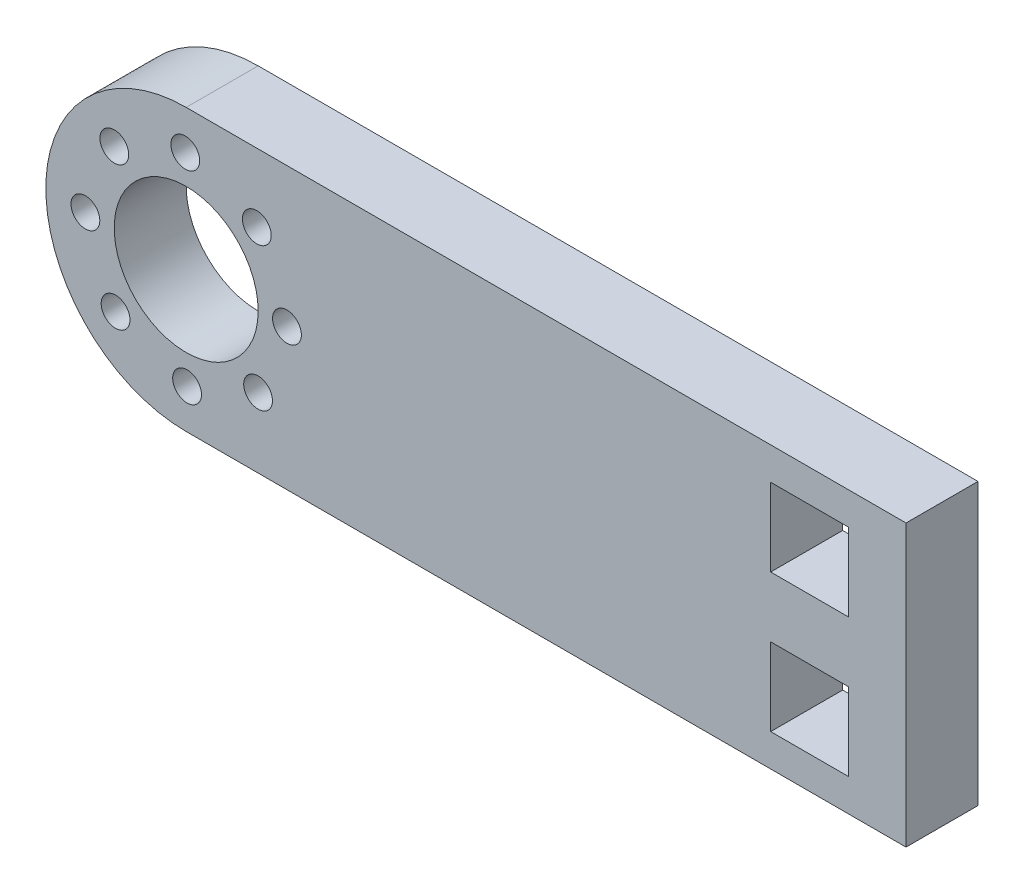
ISO-10303-21;
HEADER;
FILE_DESCRIPTION(('STEP AP214'),'2;1');
FILE_NAME('part.step','',(''),(''),'','','');
FILE_SCHEMA(('AUTOMOTIVE_DESIGN { 1 0 10303 214 1 1 1 1 }'));
ENDSEC;
DATA;
#1=APPLICATION_CONTEXT('core data for automotive mechanical design processes');
#2=APPLICATION_PROTOCOL_DEFINITION('international standard','automotive_design',2000,#1);
#3=PRODUCT_CONTEXT('',#1,'mechanical');
#4=PRODUCT('Part','Part','',(#3));
#5=PRODUCT_RELATED_PRODUCT_CATEGORY('part','',(#4));
#6=PRODUCT_DEFINITION_FORMATION('','',#4);
#7=PRODUCT_DEFINITION_CONTEXT('part definition',#1,'design');
#8=PRODUCT_DEFINITION('design','',#6,#7);
#9=PRODUCT_DEFINITION_SHAPE('','',#8);
#10=(LENGTH_UNIT() NAMED_UNIT(*) SI_UNIT(.MILLI.,.METRE.));
#11=(NAMED_UNIT(*) PLANE_ANGLE_UNIT() SI_UNIT($,.RADIAN.));
#12=(NAMED_UNIT(*) SI_UNIT($,.STERADIAN.) SOLID_ANGLE_UNIT());
#13=UNCERTAINTY_MEASURE_WITH_UNIT(LENGTH_MEASURE(1.E-05),#10,'distance_accuracy_value','');
#14=(GEOMETRIC_REPRESENTATION_CONTEXT(3) GLOBAL_UNCERTAINTY_ASSIGNED_CONTEXT((#13)) GLOBAL_UNIT_ASSIGNED_CONTEXT((#10,
#11,#12)) REPRESENTATION_CONTEXT('',''));
#15=CARTESIAN_POINT('',(0.,0.,0.));
#16=DIRECTION('',(0.,0.,1.));
#17=DIRECTION('',(1.,0.,0.));
#18=AXIS2_PLACEMENT_3D('',#15,#16,#17);
#19=CARTESIAN_POINT('',(-5.74908406047262,2.29229165398919,5.));
#20=DIRECTION('',(0.,0.,1.));
#21=DIRECTION('',(1.,0.,0.));
#22=AXIS2_PLACEMENT_3D('',#19,#20,#21);
#23=PLANE('',#22);
#24=CARTESIAN_POINT('',(-10.6544742356254,-2.7014191135177,5.));
#25=DIRECTION('',(0.,0.,1.));
#26=DIRECTION('',(1.,0.,0.));
#27=AXIS2_PLACEMENT_3D('',#24,#25,#26);
#28=CIRCLE('',#27,0.999999999999998);
#29=CARTESIAN_POINT('',(-9.65447423562543,-2.7014191135177,5.));
#30=VERTEX_POINT('',#29);
#31=EDGE_CURVE('E197',#30,#30,#28,.T.);
#32=ORIENTED_EDGE('',*,*,#31,.F.);
#33=EDGE_LOOP('',(#32));
#34=FACE_BOUND('',#33,.T.);
#35=CARTESIAN_POINT('',(-0.755373292965727,-2.61309852116362,5.));
#36=DIRECTION('',(0.,0.,1.));
#37=DIRECTION('',(1.,0.,0.));
#38=AXIS2_PLACEMENT_3D('',#35,#36,#37);
#39=CIRCLE('',#38,1.);
#40=CARTESIAN_POINT('',(0.244626707034274,-2.61309852116362,5.));
#41=VERTEX_POINT('',#40);
#42=EDGE_CURVE('E209',#41,#41,#39,.T.);
#43=ORIENTED_EDGE('',*,*,#42,.F.);
#44=EDGE_LOOP('',(#43));
#45=FACE_BOUND('',#44,.T.);
#46=CARTESIAN_POINT('',(-0.843693885319811,7.28600242149609,5.));
#47=DIRECTION('',(0.,0.,1.));
#48=DIRECTION('',(1.,0.,0.));
#49=AXIS2_PLACEMENT_3D('',#46,#47,#48);
#50=CIRCLE('',#49,1.);
#51=CARTESIAN_POINT('',(0.156306114680189,7.28600242149609,5.));
#52=VERTEX_POINT('',#51);
#53=EDGE_CURVE('E221',#52,#52,#50,.T.);
#54=ORIENTED_EDGE('',*,*,#53,.F.);
#55=EDGE_LOOP('',(#54));
#56=FACE_BOUND('',#55,.T.);
#57=CARTESIAN_POINT('',(-10.7427948279795,7.197681829142,5.));
#58=DIRECTION('',(0.,0.,1.));
#59=DIRECTION('',(1.,0.,0.));
#60=AXIS2_PLACEMENT_3D('',#57,#58,#59);
#61=CIRCLE('',#60,1.);
#62=CARTESIAN_POINT('',(-9.74279482797952,7.197681829142,5.));
#63=VERTEX_POINT('',#62);
#64=EDGE_CURVE('E233',#63,#63,#61,.T.);
#65=ORIENTED_EDGE('',*,*,#64,.F.);
#66=EDGE_LOOP('',(#65));
#67=FACE_BOUND('',#66,.T.);
#68=CARTESIAN_POINT('',(-5.74908406047262,2.29229165398919,5.));
#69=DIRECTION('',(0.,0.,1.));
#70=DIRECTION('',(1.,0.,0.));
#71=AXIS2_PLACEMENT_3D('',#68,#69,#70);
#72=CIRCLE('',#71,9.75);
#73=CARTESIAN_POINT('',(-5.74908406047262,12.0422916539892,5.));
#74=VERTEX_POINT('',#73);
#75=CARTESIAN_POINT('',(-5.74908406047262,-7.45770834601081,5.));
#76=VERTEX_POINT('',#75);
#77=EDGE_CURVE('E245',#74,#76,#72,.T.);
#78=ORIENTED_EDGE('',*,*,#77,.T.);
#79=DIRECTION('',(1.,0.,0.));
#80=VECTOR('',#79,1.);
#81=CARTESIAN_POINT('',(44.2509159395274,-7.4577083460108,5.));
#82=LINE('',#81,#80);
#83=CARTESIAN_POINT('',(44.2509159395274,-7.4577083460108,5.));
#84=VERTEX_POINT('',#83);
#85=EDGE_CURVE('E248',#76,#84,#82,.T.);
#86=ORIENTED_EDGE('',*,*,#85,.T.);
#87=DIRECTION('',(0.,1.,0.));
#88=VECTOR('',#87,1.);
#89=CARTESIAN_POINT('',(44.2509159395274,12.0422916539892,5.));
#90=LINE('',#89,#88);
#91=CARTESIAN_POINT('',(44.2509159395274,12.0422916539892,5.));
#92=VERTEX_POINT('',#91);
#93=EDGE_CURVE('E251',#84,#92,#90,.T.);
#94=ORIENTED_EDGE('',*,*,#93,.T.);
#95=DIRECTION('',(-1.,0.,0.));
#96=VECTOR('',#95,1.);
#97=CARTESIAN_POINT('',(-5.74908406047262,12.0422916539892,5.));
#98=LINE('',#97,#96);
#99=EDGE_CURVE('E253',#92,#74,#98,.T.);
#100=ORIENTED_EDGE('',*,*,#99,.T.);
#101=EDGE_LOOP('',(#78,#86,#94,#100));
#102=FACE_BOUND('',#101,.T.);
#103=CARTESIAN_POINT('',(-5.8115386358992,9.29229165398919,5.));
#104=DIRECTION('',(0.,0.,1.));
#105=DIRECTION('',(1.,0.,0.));
#106=AXIS2_PLACEMENT_3D('',#103,#104,#105);
#107=CIRCLE('',#106,0.999999999999999);
#108=CARTESIAN_POINT('',(-4.81153863589921,9.29229165398919,5.));
#109=VERTEX_POINT('',#108);
#110=EDGE_CURVE('E239',#109,#109,#107,.T.);
#111=ORIENTED_EDGE('',*,*,#110,.F.);
#112=EDGE_LOOP('',(#111));
#113=FACE_BOUND('',#112,.T.);
#114=CARTESIAN_POINT('',(-12.7490840604726,2.22983707856261,5.));
#115=DIRECTION('',(0.,0.,1.));
#116=DIRECTION('',(1.,0.,0.));
#117=AXIS2_PLACEMENT_3D('',#114,#115,#116);
#118=CIRCLE('',#117,0.999999999999998);
#119=CARTESIAN_POINT('',(-11.7490840604726,2.22983707856261,5.));
#120=VERTEX_POINT('',#119);
#121=EDGE_CURVE('E227',#120,#120,#118,.T.);
#122=ORIENTED_EDGE('',*,*,#121,.F.);
#123=EDGE_LOOP('',(#122));
#124=FACE_BOUND('',#123,.T.);
#125=CARTESIAN_POINT('',(1.25091593952738,2.35474622941577,5.));
#126=DIRECTION('',(0.,0.,1.));
#127=DIRECTION('',(1.,0.,0.));
#128=AXIS2_PLACEMENT_3D('',#125,#126,#127);
#129=CIRCLE('',#128,1.);
#130=CARTESIAN_POINT('',(2.25091593952738,2.35474622941577,5.));
#131=VERTEX_POINT('',#130);
#132=EDGE_CURVE('E215',#131,#131,#129,.T.);
#133=ORIENTED_EDGE('',*,*,#132,.F.);
#134=EDGE_LOOP('',(#133));
#135=FACE_BOUND('',#134,.T.);
#136=CARTESIAN_POINT('',(-5.68662948504604,-4.70770834601081,5.));
#137=DIRECTION('',(0.,0.,1.));
#138=DIRECTION('',(1.,0.,0.));
#139=AXIS2_PLACEMENT_3D('',#136,#137,#138);
#140=CIRCLE('',#139,1.);
#141=CARTESIAN_POINT('',(-4.68662948504604,-4.70770834601081,5.));
#142=VERTEX_POINT('',#141);
#143=EDGE_CURVE('E203',#142,#142,#140,.T.);
#144=ORIENTED_EDGE('',*,*,#143,.F.);
#145=EDGE_LOOP('',(#144));
#146=FACE_BOUND('',#145,.T.);
#147=CARTESIAN_POINT('',(-5.74908406047262,2.29229165398919,5.));
#148=DIRECTION('',(0.,0.,1.));
#149=DIRECTION('',(1.,0.,0.));
#150=AXIS2_PLACEMENT_3D('',#147,#148,#149);
#151=CIRCLE('',#150,5.);
#152=CARTESIAN_POINT('',(-0.749084060472621,2.29229165398919,5.));
#153=VERTEX_POINT('',#152);
#154=EDGE_CURVE('E191',#153,#153,#151,.T.);
#155=ORIENTED_EDGE('',*,*,#154,.F.);
#156=EDGE_LOOP('',(#155));
#157=FACE_BOUND('',#156,.T.);
#158=DIRECTION('',(1.,0.,0.));
#159=VECTOR('',#158,1.);
#160=CARTESIAN_POINT('',(34.8509159395274,4.39229165398919,5.));
#161=LINE('',#160,#159);
#162=CARTESIAN_POINT('',(34.8509159395274,4.39229165398919,5.));
#163=VERTEX_POINT('',#162);
#164=CARTESIAN_POINT('',(40.2509159395274,4.39229165398919,5.));
#165=VERTEX_POINT('',#164);
#166=EDGE_CURVE('E162',#163,#165,#161,.T.);
#167=ORIENTED_EDGE('',*,*,#166,.F.);
#168=DIRECTION('',(0.,-1.,0.));
#169=VECTOR('',#168,1.);
#170=CARTESIAN_POINT('',(34.8509159395274,9.79229165398919,5.));
#171=LINE('',#170,#169);
#172=CARTESIAN_POINT('',(34.8509159395274,9.79229165398919,5.));
#173=VERTEX_POINT('',#172);
#174=EDGE_CURVE('E160',#173,#163,#171,.T.);
#175=ORIENTED_EDGE('',*,*,#174,.F.);
#176=DIRECTION('',(-1.,0.,0.));
#177=VECTOR('',#176,1.);
#178=CARTESIAN_POINT('',(34.8509159395274,9.79229165398919,5.));
#179=LINE('',#178,#177);
#180=CARTESIAN_POINT('',(40.2509159395274,9.79229165398919,5.));
#181=VERTEX_POINT('',#180);
#182=EDGE_CURVE('E168',#181,#173,#179,.T.);
#183=ORIENTED_EDGE('',*,*,#182,.F.);
#184=DIRECTION('',(0.,1.,0.));
#185=VECTOR('',#184,1.);
#186=CARTESIAN_POINT('',(40.2509159395274,9.79229165398919,5.));
#187=LINE('',#186,#185);
#188=EDGE_CURVE('E165',#165,#181,#187,.T.);
#189=ORIENTED_EDGE('',*,*,#188,.F.);
#190=EDGE_LOOP('',(#167,#175,#183,#189));
#191=FACE_BOUND('',#190,.T.);
#192=DIRECTION('',(1.,0.,0.));
#193=VECTOR('',#192,1.);
#194=CARTESIAN_POINT('',(34.8509159395274,-5.20770834601081,5.));
#195=LINE('',#194,#193);
#196=CARTESIAN_POINT('',(34.8509159395274,-5.20770834601081,5.));
#197=VERTEX_POINT('',#196);
#198=CARTESIAN_POINT('',(40.2509159395274,-5.20770834601081,5.));
#199=VERTEX_POINT('',#198);
#200=EDGE_CURVE('E132',#197,#199,#195,.T.);
#201=ORIENTED_EDGE('',*,*,#200,.F.);
#202=DIRECTION('',(0.,-1.,0.));
#203=VECTOR('',#202,1.);
#204=CARTESIAN_POINT('',(34.8509159395274,0.192291653989192,5.));
#205=LINE('',#204,#203);
#206=CARTESIAN_POINT('',(34.8509159395274,0.192291653989192,5.));
#207=VERTEX_POINT('',#206);
#208=EDGE_CURVE('E124',#207,#197,#205,.T.);
#209=ORIENTED_EDGE('',*,*,#208,.F.);
#210=DIRECTION('',(-1.,0.,0.));
#211=VECTOR('',#210,1.);
#212=CARTESIAN_POINT('',(34.8509159395274,0.192291653989192,5.));
#213=LINE('',#212,#211);
#214=CARTESIAN_POINT('',(40.2509159395274,0.192291653989191,5.));
#215=VERTEX_POINT('',#214);
#216=EDGE_CURVE('E146',#215,#207,#213,.T.);
#217=ORIENTED_EDGE('',*,*,#216,.F.);
#218=DIRECTION('',(0.,1.,0.));
#219=VECTOR('',#218,1.);
#220=CARTESIAN_POINT('',(40.2509159395274,0.192291653989192,5.));
#221=LINE('',#220,#219);
#222=EDGE_CURVE('E144',#199,#215,#221,.T.);
#223=ORIENTED_EDGE('',*,*,#222,.F.);
#224=EDGE_LOOP('',(#201,#209,#217,#223));
#225=FACE_BOUND('',#224,.T.);
#226=ADVANCED_FACE('F35',(#34,#45,#56,#67,#102,#113,#124,#135,#146,#157,#191,#225),#23,.T.);
#227=CARTESIAN_POINT('',(-5.74908406047262,2.29229165398919,0.));
#228=DIRECTION('',(0.,0.,1.));
#229=DIRECTION('',(1.,0.,0.));
#230=AXIS2_PLACEMENT_3D('',#227,#228,#229);
#231=PLANE('',#230);
#232=DIRECTION('',(0.,-1.,0.));
#233=VECTOR('',#232,1.);
#234=CARTESIAN_POINT('',(34.8509159395274,9.79229165398919,0.));
#235=LINE('',#234,#233);
#236=CARTESIAN_POINT('',(34.8509159395274,9.79229165398919,0.));
#237=VERTEX_POINT('',#236);
#238=CARTESIAN_POINT('',(34.8509159395274,4.39229165398919,0.));
#239=VERTEX_POINT('',#238);
#240=EDGE_CURVE('E140',#237,#239,#235,.T.);
#241=ORIENTED_EDGE('',*,*,#240,.T.);
#242=DIRECTION('',(1.,0.,0.));
#243=VECTOR('',#242,1.);
#244=CARTESIAN_POINT('',(34.8509159395274,4.39229165398919,0.));
#245=LINE('',#244,#243);
#246=CARTESIAN_POINT('',(40.2509159395274,4.39229165398919,0.));
#247=VERTEX_POINT('',#246);
#248=EDGE_CURVE('E173',#239,#247,#245,.T.);
#249=ORIENTED_EDGE('',*,*,#248,.T.);
#250=DIRECTION('',(0.,1.,0.));
#251=VECTOR('',#250,1.);
#252=CARTESIAN_POINT('',(40.2509159395274,9.79229165398919,0.));
#253=LINE('',#252,#251);
#254=CARTESIAN_POINT('',(40.2509159395274,9.79229165398919,0.));
#255=VERTEX_POINT('',#254);
#256=EDGE_CURVE('E176',#247,#255,#253,.T.);
#257=ORIENTED_EDGE('',*,*,#256,.T.);
#258=DIRECTION('',(-1.,0.,0.));
#259=VECTOR('',#258,1.);
#260=CARTESIAN_POINT('',(34.8509159395274,9.79229165398919,0.));
#261=LINE('',#260,#259);
#262=EDGE_CURVE('E163',#255,#237,#261,.T.);
#263=ORIENTED_EDGE('',*,*,#262,.T.);
#264=EDGE_LOOP('',(#241,#249,#257,#263));
#265=FACE_BOUND('',#264,.T.);
#266=CARTESIAN_POINT('',(-5.74908406047262,2.29229165398919,0.));
#267=DIRECTION('',(0.,0.,1.));
#268=DIRECTION('',(1.,0.,0.));
#269=AXIS2_PLACEMENT_3D('',#266,#267,#268);
#270=CIRCLE('',#269,9.75);
#271=CARTESIAN_POINT('',(-5.74908406047262,12.0422916539892,0.));
#272=VERTEX_POINT('',#271);
#273=CARTESIAN_POINT('',(-5.74908406047262,-7.45770834601081,0.));
#274=VERTEX_POINT('',#273);
#275=EDGE_CURVE('E242',#272,#274,#270,.T.);
#276=ORIENTED_EDGE('',*,*,#275,.F.);
#277=DIRECTION('',(-1.,0.,0.));
#278=VECTOR('',#277,1.);
#279=CARTESIAN_POINT('',(-5.74908406047262,12.0422916539892,0.));
#280=LINE('',#279,#278);
#281=CARTESIAN_POINT('',(44.2509159395274,12.0422916539892,0.));
#282=VERTEX_POINT('',#281);
#283=EDGE_CURVE('E249',#282,#272,#280,.T.);
#284=ORIENTED_EDGE('',*,*,#283,.F.);
#285=DIRECTION('',(0.,1.,0.));
#286=VECTOR('',#285,1.);
#287=CARTESIAN_POINT('',(44.2509159395274,12.0422916539892,0.));
#288=LINE('',#287,#286);
#289=CARTESIAN_POINT('',(44.2509159395274,-7.4577083460108,0.));
#290=VERTEX_POINT('',#289);
#291=EDGE_CURVE('E260',#290,#282,#288,.T.);
#292=ORIENTED_EDGE('',*,*,#291,.F.);
#293=DIRECTION('',(1.,0.,0.));
#294=VECTOR('',#293,1.);
#295=CARTESIAN_POINT('',(44.2509159395274,-7.4577083460108,0.));
#296=LINE('',#295,#294);
#297=EDGE_CURVE('E258',#274,#290,#296,.T.);
#298=ORIENTED_EDGE('',*,*,#297,.F.);
#299=EDGE_LOOP('',(#276,#284,#292,#298));
#300=FACE_BOUND('',#299,.T.);
#301=CARTESIAN_POINT('',(-5.8115386358992,9.29229165398919,0.));
#302=DIRECTION('',(0.,0.,1.));
#303=DIRECTION('',(1.,0.,0.));
#304=AXIS2_PLACEMENT_3D('',#301,#302,#303);
#305=CIRCLE('',#304,0.999999999999999);
#306=CARTESIAN_POINT('',(-4.81153863589921,9.29229165398919,0.));
#307=VERTEX_POINT('',#306);
#308=EDGE_CURVE('E236',#307,#307,#305,.T.);
#309=ORIENTED_EDGE('',*,*,#308,.T.);
#310=EDGE_LOOP('',(#309));
#311=FACE_BOUND('',#310,.T.);
#312=CARTESIAN_POINT('',(-10.7427948279795,7.197681829142,0.));
#313=DIRECTION('',(0.,0.,1.));
#314=DIRECTION('',(1.,0.,0.));
#315=AXIS2_PLACEMENT_3D('',#312,#313,#314);
#316=CIRCLE('',#315,1.);
#317=CARTESIAN_POINT('',(-9.74279482797952,7.197681829142,0.));
#318=VERTEX_POINT('',#317);
#319=EDGE_CURVE('E230',#318,#318,#316,.T.);
#320=ORIENTED_EDGE('',*,*,#319,.T.);
#321=EDGE_LOOP('',(#320));
#322=FACE_BOUND('',#321,.T.);
#323=CARTESIAN_POINT('',(-12.7490840604726,2.22983707856261,0.));
#324=DIRECTION('',(0.,0.,1.));
#325=DIRECTION('',(1.,0.,0.));
#326=AXIS2_PLACEMENT_3D('',#323,#324,#325);
#327=CIRCLE('',#326,0.999999999999998);
#328=CARTESIAN_POINT('',(-11.7490840604726,2.22983707856261,0.));
#329=VERTEX_POINT('',#328);
#330=EDGE_CURVE('E224',#329,#329,#327,.T.);
#331=ORIENTED_EDGE('',*,*,#330,.T.);
#332=EDGE_LOOP('',(#331));
#333=FACE_BOUND('',#332,.T.);
#334=CARTESIAN_POINT('',(-0.843693885319811,7.28600242149609,0.));
#335=DIRECTION('',(0.,0.,1.));
#336=DIRECTION('',(1.,0.,0.));
#337=AXIS2_PLACEMENT_3D('',#334,#335,#336);
#338=CIRCLE('',#337,1.);
#339=CARTESIAN_POINT('',(0.156306114680189,7.28600242149609,0.));
#340=VERTEX_POINT('',#339);
#341=EDGE_CURVE('E218',#340,#340,#338,.T.);
#342=ORIENTED_EDGE('',*,*,#341,.T.);
#343=EDGE_LOOP('',(#342));
#344=FACE_BOUND('',#343,.T.);
#345=CARTESIAN_POINT('',(1.25091593952738,2.35474622941577,0.));
#346=DIRECTION('',(0.,0.,1.));
#347=DIRECTION('',(1.,0.,0.));
#348=AXIS2_PLACEMENT_3D('',#345,#346,#347);
#349=CIRCLE('',#348,1.);
#350=CARTESIAN_POINT('',(2.25091593952738,2.35474622941577,0.));
#351=VERTEX_POINT('',#350);
#352=EDGE_CURVE('E212',#351,#351,#349,.T.);
#353=ORIENTED_EDGE('',*,*,#352,.T.);
#354=EDGE_LOOP('',(#353));
#355=FACE_BOUND('',#354,.T.);
#356=CARTESIAN_POINT('',(-0.755373292965727,-2.61309852116362,0.));
#357=DIRECTION('',(0.,0.,1.));
#358=DIRECTION('',(1.,0.,0.));
#359=AXIS2_PLACEMENT_3D('',#356,#357,#358);
#360=CIRCLE('',#359,1.);
#361=CARTESIAN_POINT('',(0.244626707034274,-2.61309852116362,0.));
#362=VERTEX_POINT('',#361);
#363=EDGE_CURVE('E206',#362,#362,#360,.T.);
#364=ORIENTED_EDGE('',*,*,#363,.T.);
#365=EDGE_LOOP('',(#364));
#366=FACE_BOUND('',#365,.T.);
#367=CARTESIAN_POINT('',(-5.68662948504604,-4.70770834601081,0.));
#368=DIRECTION('',(0.,0.,1.));
#369=DIRECTION('',(1.,0.,0.));
#370=AXIS2_PLACEMENT_3D('',#367,#368,#369);
#371=CIRCLE('',#370,1.);
#372=CARTESIAN_POINT('',(-4.68662948504604,-4.70770834601081,0.));
#373=VERTEX_POINT('',#372);
#374=EDGE_CURVE('E200',#373,#373,#371,.T.);
#375=ORIENTED_EDGE('',*,*,#374,.T.);
#376=EDGE_LOOP('',(#375));
#377=FACE_BOUND('',#376,.T.);
#378=CARTESIAN_POINT('',(-10.6544742356254,-2.7014191135177,0.));
#379=DIRECTION('',(0.,0.,1.));
#380=DIRECTION('',(1.,0.,0.));
#381=AXIS2_PLACEMENT_3D('',#378,#379,#380);
#382=CIRCLE('',#381,0.999999999999998);
#383=CARTESIAN_POINT('',(-9.65447423562543,-2.7014191135177,0.));
#384=VERTEX_POINT('',#383);
#385=EDGE_CURVE('E194',#384,#384,#382,.T.);
#386=ORIENTED_EDGE('',*,*,#385,.T.);
#387=EDGE_LOOP('',(#386));
#388=FACE_BOUND('',#387,.T.);
#389=CARTESIAN_POINT('',(-5.74908406047262,2.29229165398919,0.));
#390=DIRECTION('',(0.,0.,1.));
#391=DIRECTION('',(1.,0.,0.));
#392=AXIS2_PLACEMENT_3D('',#389,#390,#391);
#393=CIRCLE('',#392,5.);
#394=CARTESIAN_POINT('',(-0.749084060472621,2.29229165398919,0.));
#395=VERTEX_POINT('',#394);
#396=EDGE_CURVE('E190',#395,#395,#393,.T.);
#397=ORIENTED_EDGE('',*,*,#396,.T.);
#398=EDGE_LOOP('',(#397));
#399=FACE_BOUND('',#398,.T.);
#400=DIRECTION('',(0.,-1.,0.));
#401=VECTOR('',#400,1.);
#402=CARTESIAN_POINT('',(34.8509159395274,0.192291653989192,0.));
#403=LINE('',#402,#401);
#404=CARTESIAN_POINT('',(34.8509159395274,0.192291653989191,0.));
#405=VERTEX_POINT('',#404);
#406=CARTESIAN_POINT('',(34.8509159395274,-5.20770834601081,0.));
#407=VERTEX_POINT('',#406);
#408=EDGE_CURVE('E58',#405,#407,#403,.T.);
#409=ORIENTED_EDGE('',*,*,#408,.T.);
#410=DIRECTION('',(1.,0.,0.));
#411=VECTOR('',#410,1.);
#412=CARTESIAN_POINT('',(34.8509159395274,-5.20770834601081,0.));
#413=LINE('',#412,#411);
#414=CARTESIAN_POINT('',(40.2509159395274,-5.20770834601081,0.));
#415=VERTEX_POINT('',#414);
#416=EDGE_CURVE('E139',#407,#415,#413,.T.);
#417=ORIENTED_EDGE('',*,*,#416,.T.);
#418=DIRECTION('',(0.,1.,0.));
#419=VECTOR('',#418,1.);
#420=CARTESIAN_POINT('',(40.2509159395274,0.192291653989192,0.));
#421=LINE('',#420,#419);
#422=CARTESIAN_POINT('',(40.2509159395274,0.192291653989192,0.));
#423=VERTEX_POINT('',#422);
#424=EDGE_CURVE('E152',#415,#423,#421,.T.);
#425=ORIENTED_EDGE('',*,*,#424,.T.);
#426=DIRECTION('',(-1.,0.,0.));
#427=VECTOR('',#426,1.);
#428=CARTESIAN_POINT('',(34.8509159395274,0.192291653989192,0.));
#429=LINE('',#428,#427);
#430=EDGE_CURVE('E133',#423,#405,#429,.T.);
#431=ORIENTED_EDGE('',*,*,#430,.T.);
#432=EDGE_LOOP('',(#409,#417,#425,#431));
#433=FACE_BOUND('',#432,.T.);
#434=ADVANCED_FACE('F278',(#265,#300,#311,#322,#333,#344,#355,#366,#377,#388,#399,#433),#231,.F.);
#435=CARTESIAN_POINT('',(-5.74908406047262,2.29229165398919,5.));
#436=DIRECTION('',(0.,0.,-1.));
#437=DIRECTION('',(-1.,0.,0.));
#438=AXIS2_PLACEMENT_3D('',#435,#436,#437);
#439=CYLINDRICAL_SURFACE('',#438,9.75);
#440=ORIENTED_EDGE('',*,*,#275,.T.);
#441=DIRECTION('',(0.,0.,-1.));
#442=VECTOR('',#441,1.);
#443=CARTESIAN_POINT('',(-5.74908406047262,-7.45770834601081,5.));
#444=LINE('',#443,#442);
#445=EDGE_CURVE('E11',#76,#274,#444,.T.);
#446=ORIENTED_EDGE('',*,*,#445,.F.);
#447=ORIENTED_EDGE('',*,*,#77,.F.);
#448=DIRECTION('',(0.,0.,-1.));
#449=VECTOR('',#448,1.);
#450=CARTESIAN_POINT('',(-5.74908406047262,12.0422916539892,5.));
#451=LINE('',#450,#449);
#452=EDGE_CURVE('E255',#74,#272,#451,.T.);
#453=ORIENTED_EDGE('',*,*,#452,.T.);
#454=EDGE_LOOP('',(#440,#446,#447,#453));
#455=FACE_BOUND('',#454,.T.);
#456=ADVANCED_FACE('F37',(#455),#439,.T.);
#457=CARTESIAN_POINT('',(44.2509159395274,-7.4577083460108,5.));
#458=DIRECTION('',(0.,1.,0.));
#459=DIRECTION('',(-1.,0.,0.));
#460=AXIS2_PLACEMENT_3D('',#457,#458,#459);
#461=PLANE('',#460);
#462=ORIENTED_EDGE('',*,*,#297,.T.);
#463=DIRECTION('',(0.,0.,-1.));
#464=VECTOR('',#463,1.);
#465=CARTESIAN_POINT('',(44.2509159395274,-7.4577083460108,5.));
#466=LINE('',#465,#464);
#467=EDGE_CURVE('E43',#84,#290,#466,.T.);
#468=ORIENTED_EDGE('',*,*,#467,.F.);
#469=ORIENTED_EDGE('',*,*,#85,.F.);
#470=ORIENTED_EDGE('',*,*,#445,.T.);
#471=EDGE_LOOP('',(#462,#468,#469,#470));
#472=FACE_BOUND('',#471,.T.);
#473=ADVANCED_FACE('F289',(#472),#461,.F.);
#474=CARTESIAN_POINT('',(44.2509159395274,12.0422916539892,5.));
#475=DIRECTION('',(-1.,0.,0.));
#476=DIRECTION('',(0.,0.,1.));
#477=AXIS2_PLACEMENT_3D('',#474,#475,#476);
#478=PLANE('',#477);
#479=ORIENTED_EDGE('',*,*,#291,.T.);
#480=DIRECTION('',(0.,0.,-1.));
#481=VECTOR('',#480,1.);
#482=CARTESIAN_POINT('',(44.2509159395274,12.0422916539892,5.));
#483=LINE('',#482,#481);
#484=EDGE_CURVE('E265',#92,#282,#483,.T.);
#485=ORIENTED_EDGE('',*,*,#484,.F.);
#486=ORIENTED_EDGE('',*,*,#93,.F.);
#487=ORIENTED_EDGE('',*,*,#467,.T.);
#488=EDGE_LOOP('',(#479,#485,#486,#487));
#489=FACE_BOUND('',#488,.T.);
#490=ADVANCED_FACE('F272',(#489),#478,.F.);
#491=CARTESIAN_POINT('',(-5.74908406047262,12.0422916539892,5.));
#492=DIRECTION('',(0.,-1.,0.));
#493=DIRECTION('',(0.,0.,-1.));
#494=AXIS2_PLACEMENT_3D('',#491,#492,#493);
#495=PLANE('',#494);
#496=ORIENTED_EDGE('',*,*,#283,.T.);
#497=ORIENTED_EDGE('',*,*,#452,.F.);
#498=ORIENTED_EDGE('',*,*,#99,.F.);
#499=ORIENTED_EDGE('',*,*,#484,.T.);
#500=EDGE_LOOP('',(#496,#497,#498,#499));
#501=FACE_BOUND('',#500,.T.);
#502=ADVANCED_FACE('F282',(#501),#495,.F.);
#503=CARTESIAN_POINT('',(-5.8115386358992,9.29229165398919,5.));
#504=DIRECTION('',(0.,0.,-1.));
#505=DIRECTION('',(-1.,0.,0.));
#506=AXIS2_PLACEMENT_3D('',#503,#504,#505);
#507=CYLINDRICAL_SURFACE('',#506,0.999999999999999);
#508=ORIENTED_EDGE('',*,*,#110,.T.);
#509=EDGE_LOOP('',(#508));
#510=FACE_BOUND('',#509,.T.);
#511=ORIENTED_EDGE('',*,*,#308,.F.);
#512=EDGE_LOOP('',(#511));
#513=FACE_BOUND('',#512,.T.);
#514=ADVANCED_FACE('F307',(#510,#513),#507,.F.);
#515=CARTESIAN_POINT('',(-10.7427948279795,7.197681829142,5.));
#516=DIRECTION('',(0.,0.,-1.));
#517=DIRECTION('',(-1.,0.,0.));
#518=AXIS2_PLACEMENT_3D('',#515,#516,#517);
#519=CYLINDRICAL_SURFACE('',#518,1.);
#520=ORIENTED_EDGE('',*,*,#64,.T.);
#521=EDGE_LOOP('',(#520));
#522=FACE_BOUND('',#521,.T.);
#523=ORIENTED_EDGE('',*,*,#319,.F.);
#524=EDGE_LOOP('',(#523));
#525=FACE_BOUND('',#524,.T.);
#526=ADVANCED_FACE('F314',(#522,#525),#519,.F.);
#527=CARTESIAN_POINT('',(-12.7490840604726,2.22983707856261,5.));
#528=DIRECTION('',(0.,0.,-1.));
#529=DIRECTION('',(-1.,0.,0.));
#530=AXIS2_PLACEMENT_3D('',#527,#528,#529);
#531=CYLINDRICAL_SURFACE('',#530,0.999999999999998);
#532=ORIENTED_EDGE('',*,*,#121,.T.);
#533=EDGE_LOOP('',(#532));
#534=FACE_BOUND('',#533,.T.);
#535=ORIENTED_EDGE('',*,*,#330,.F.);
#536=EDGE_LOOP('',(#535));
#537=FACE_BOUND('',#536,.T.);
#538=ADVANCED_FACE('F319',(#534,#537),#531,.F.);
#539=CARTESIAN_POINT('',(-0.843693885319811,7.28600242149609,5.));
#540=DIRECTION('',(0.,0.,-1.));
#541=DIRECTION('',(-1.,0.,0.));
#542=AXIS2_PLACEMENT_3D('',#539,#540,#541);
#543=CYLINDRICAL_SURFACE('',#542,1.);
#544=ORIENTED_EDGE('',*,*,#53,.T.);
#545=EDGE_LOOP('',(#544));
#546=FACE_BOUND('',#545,.T.);
#547=ORIENTED_EDGE('',*,*,#341,.F.);
#548=EDGE_LOOP('',(#547));
#549=FACE_BOUND('',#548,.T.);
#550=ADVANCED_FACE('F391',(#546,#549),#543,.F.);
#551=CARTESIAN_POINT('',(1.25091593952738,2.35474622941577,5.));
#552=DIRECTION('',(0.,0.,-1.));
#553=DIRECTION('',(-1.,0.,0.));
#554=AXIS2_PLACEMENT_3D('',#551,#552,#553);
#555=CYLINDRICAL_SURFACE('',#554,1.);
#556=ORIENTED_EDGE('',*,*,#132,.T.);
#557=EDGE_LOOP('',(#556));
#558=FACE_BOUND('',#557,.T.);
#559=ORIENTED_EDGE('',*,*,#352,.F.);
#560=EDGE_LOOP('',(#559));
#561=FACE_BOUND('',#560,.T.);
#562=ADVANCED_FACE('F387',(#558,#561),#555,.F.);
#563=CARTESIAN_POINT('',(-0.755373292965727,-2.61309852116362,5.));
#564=DIRECTION('',(0.,0.,-1.));
#565=DIRECTION('',(-1.,0.,0.));
#566=AXIS2_PLACEMENT_3D('',#563,#564,#565);
#567=CYLINDRICAL_SURFACE('',#566,1.);
#568=ORIENTED_EDGE('',*,*,#42,.T.);
#569=EDGE_LOOP('',(#568));
#570=FACE_BOUND('',#569,.T.);
#571=ORIENTED_EDGE('',*,*,#363,.F.);
#572=EDGE_LOOP('',(#571));
#573=FACE_BOUND('',#572,.T.);
#574=ADVANCED_FACE('F383',(#570,#573),#567,.F.);
#575=CARTESIAN_POINT('',(-5.68662948504604,-4.70770834601081,5.));
#576=DIRECTION('',(0.,0.,-1.));
#577=DIRECTION('',(-1.,0.,0.));
#578=AXIS2_PLACEMENT_3D('',#575,#576,#577);
#579=CYLINDRICAL_SURFACE('',#578,1.);
#580=ORIENTED_EDGE('',*,*,#143,.T.);
#581=EDGE_LOOP('',(#580));
#582=FACE_BOUND('',#581,.T.);
#583=ORIENTED_EDGE('',*,*,#374,.F.);
#584=EDGE_LOOP('',(#583));
#585=FACE_BOUND('',#584,.T.);
#586=ADVANCED_FACE('F379',(#582,#585),#579,.F.);
#587=CARTESIAN_POINT('',(-10.6544742356254,-2.7014191135177,5.));
#588=DIRECTION('',(0.,0.,-1.));
#589=DIRECTION('',(-1.,0.,0.));
#590=AXIS2_PLACEMENT_3D('',#587,#588,#589);
#591=CYLINDRICAL_SURFACE('',#590,0.999999999999998);
#592=ORIENTED_EDGE('',*,*,#31,.T.);
#593=EDGE_LOOP('',(#592));
#594=FACE_BOUND('',#593,.T.);
#595=ORIENTED_EDGE('',*,*,#385,.F.);
#596=EDGE_LOOP('',(#595));
#597=FACE_BOUND('',#596,.T.);
#598=ADVANCED_FACE('F375',(#594,#597),#591,.F.);
#599=CARTESIAN_POINT('',(-5.74908406047262,2.29229165398919,5.));
#600=DIRECTION('',(0.,0.,-1.));
#601=DIRECTION('',(-1.,0.,0.));
#602=AXIS2_PLACEMENT_3D('',#599,#600,#601);
#603=CYLINDRICAL_SURFACE('',#602,5.);
#604=ORIENTED_EDGE('',*,*,#154,.T.);
#605=EDGE_LOOP('',(#604));
#606=FACE_BOUND('',#605,.T.);
#607=ORIENTED_EDGE('',*,*,#396,.F.);
#608=EDGE_LOOP('',(#607));
#609=FACE_BOUND('',#608,.T.);
#610=ADVANCED_FACE('F371',(#606,#609),#603,.F.);
#611=CARTESIAN_POINT('',(34.8509159395274,9.79229165398919,5.));
#612=DIRECTION('',(1.,0.,0.));
#613=DIRECTION('',(0.,0.,-1.));
#614=AXIS2_PLACEMENT_3D('',#611,#612,#613);
#615=PLANE('',#614);
#616=ORIENTED_EDGE('',*,*,#240,.F.);
#617=DIRECTION('',(0.,0.,-1.));
#618=VECTOR('',#617,1.);
#619=CARTESIAN_POINT('',(34.8509159395274,9.79229165398919,5.));
#620=LINE('',#619,#618);
#621=EDGE_CURVE('E170',#173,#237,#620,.T.);
#622=ORIENTED_EDGE('',*,*,#621,.F.);
#623=ORIENTED_EDGE('',*,*,#174,.T.);
#624=DIRECTION('',(0.,0.,-1.));
#625=VECTOR('',#624,1.);
#626=CARTESIAN_POINT('',(34.8509159395274,4.39229165398919,5.));
#627=LINE('',#626,#625);
#628=EDGE_CURVE('E187',#163,#239,#627,.T.);
#629=ORIENTED_EDGE('',*,*,#628,.T.);
#630=EDGE_LOOP('',(#616,#622,#623,#629));
#631=FACE_BOUND('',#630,.T.);
#632=ADVANCED_FACE('F367',(#631),#615,.T.);
#633=CARTESIAN_POINT('',(34.8509159395274,4.39229165398919,5.));
#634=DIRECTION('',(0.,1.,0.));
#635=DIRECTION('',(0.,0.,1.));
#636=AXIS2_PLACEMENT_3D('',#633,#634,#635);
#637=PLANE('',#636);
#638=ORIENTED_EDGE('',*,*,#248,.F.);
#639=ORIENTED_EDGE('',*,*,#628,.F.);
#640=ORIENTED_EDGE('',*,*,#166,.T.);
#641=DIRECTION('',(0.,0.,-1.));
#642=VECTOR('',#641,1.);
#643=CARTESIAN_POINT('',(40.2509159395274,4.39229165398919,5.));
#644=LINE('',#643,#642);
#645=EDGE_CURVE('E185',#165,#247,#644,.T.);
#646=ORIENTED_EDGE('',*,*,#645,.T.);
#647=EDGE_LOOP('',(#638,#639,#640,#646));
#648=FACE_BOUND('',#647,.T.);
#649=ADVANCED_FACE('F363',(#648),#637,.T.);
#650=CARTESIAN_POINT('',(40.2509159395274,9.79229165398919,5.));
#651=DIRECTION('',(-1.,0.,0.));
#652=DIRECTION('',(0.,0.,1.));
#653=AXIS2_PLACEMENT_3D('',#650,#651,#652);
#654=PLANE('',#653);
#655=ORIENTED_EDGE('',*,*,#256,.F.);
#656=ORIENTED_EDGE('',*,*,#645,.F.);
#657=ORIENTED_EDGE('',*,*,#188,.T.);
#658=DIRECTION('',(0.,0.,-1.));
#659=VECTOR('',#658,1.);
#660=CARTESIAN_POINT('',(40.2509159395274,9.79229165398919,5.));
#661=LINE('',#660,#659);
#662=EDGE_CURVE('E183',#181,#255,#661,.T.);
#663=ORIENTED_EDGE('',*,*,#662,.T.);
#664=EDGE_LOOP('',(#655,#656,#657,#663));
#665=FACE_BOUND('',#664,.T.);
#666=ADVANCED_FACE('F359',(#665),#654,.T.);
#667=CARTESIAN_POINT('',(34.8509159395274,9.79229165398919,5.));
#668=DIRECTION('',(0.,-1.,0.));
#669=DIRECTION('',(1.,0.,0.));
#670=AXIS2_PLACEMENT_3D('',#667,#668,#669);
#671=PLANE('',#670);
#672=ORIENTED_EDGE('',*,*,#262,.F.);
#673=ORIENTED_EDGE('',*,*,#662,.F.);
#674=ORIENTED_EDGE('',*,*,#182,.T.);
#675=ORIENTED_EDGE('',*,*,#621,.T.);
#676=EDGE_LOOP('',(#672,#673,#674,#675));
#677=FACE_BOUND('',#676,.T.);
#678=ADVANCED_FACE('F356',(#677),#671,.T.);
#679=CARTESIAN_POINT('',(34.8509159395274,0.192291653989192,5.));
#680=DIRECTION('',(1.,0.,0.));
#681=DIRECTION('',(0.,0.,-1.));
#682=AXIS2_PLACEMENT_3D('',#679,#680,#681);
#683=PLANE('',#682);
#684=ORIENTED_EDGE('',*,*,#408,.F.);
#685=DIRECTION('',(0.,0.,-1.));
#686=VECTOR('',#685,1.);
#687=CARTESIAN_POINT('',(34.8509159395274,0.192291653989192,5.));
#688=LINE('',#687,#686);
#689=EDGE_CURVE('E128',#207,#405,#688,.T.);
#690=ORIENTED_EDGE('',*,*,#689,.F.);
#691=ORIENTED_EDGE('',*,*,#208,.T.);
#692=DIRECTION('',(0.,0.,-1.));
#693=VECTOR('',#692,1.);
#694=CARTESIAN_POINT('',(34.8509159395274,-5.20770834601081,5.));
#695=LINE('',#694,#693);
#696=EDGE_CURVE('E127',#197,#407,#695,.T.);
#697=ORIENTED_EDGE('',*,*,#696,.T.);
#698=EDGE_LOOP('',(#684,#690,#691,#697));
#699=FACE_BOUND('',#698,.T.);
#700=ADVANCED_FACE('F126',(#699),#683,.T.);
#701=CARTESIAN_POINT('',(34.8509159395274,-5.20770834601081,5.));
#702=DIRECTION('',(0.,1.,0.));
#703=DIRECTION('',(-1.,0.,0.));
#704=AXIS2_PLACEMENT_3D('',#701,#702,#703);
#705=PLANE('',#704);
#706=ORIENTED_EDGE('',*,*,#416,.F.);
#707=ORIENTED_EDGE('',*,*,#696,.F.);
#708=ORIENTED_EDGE('',*,*,#200,.T.);
#709=DIRECTION('',(0.,0.,-1.));
#710=VECTOR('',#709,1.);
#711=CARTESIAN_POINT('',(40.2509159395274,-5.20770834601081,5.));
#712=LINE('',#711,#710);
#713=EDGE_CURVE('E141',#199,#415,#712,.T.);
#714=ORIENTED_EDGE('',*,*,#713,.T.);
#715=EDGE_LOOP('',(#706,#707,#708,#714));
#716=FACE_BOUND('',#715,.T.);
#717=ADVANCED_FACE('F136',(#716),#705,.T.);
#718=CARTESIAN_POINT('',(40.2509159395274,0.192291653989192,5.));
#719=DIRECTION('',(-1.,0.,0.));
#720=DIRECTION('',(0.,0.,1.));
#721=AXIS2_PLACEMENT_3D('',#718,#719,#720);
#722=PLANE('',#721);
#723=ORIENTED_EDGE('',*,*,#424,.F.);
#724=ORIENTED_EDGE('',*,*,#713,.F.);
#725=ORIENTED_EDGE('',*,*,#222,.T.);
#726=DIRECTION('',(0.,0.,-1.));
#727=VECTOR('',#726,1.);
#728=CARTESIAN_POINT('',(40.2509159395274,0.192291653989192,5.));
#729=LINE('',#728,#727);
#730=EDGE_CURVE('E50',#215,#423,#729,.T.);
#731=ORIENTED_EDGE('',*,*,#730,.T.);
#732=EDGE_LOOP('',(#723,#724,#725,#731));
#733=FACE_BOUND('',#732,.T.);
#734=ADVANCED_FACE('F344',(#733),#722,.T.);
#735=CARTESIAN_POINT('',(34.8509159395274,0.192291653989192,5.));
#736=DIRECTION('',(0.,-1.,0.));
#737=DIRECTION('',(1.,0.,0.));
#738=AXIS2_PLACEMENT_3D('',#735,#736,#737);
#739=PLANE('',#738);
#740=ORIENTED_EDGE('',*,*,#430,.F.);
#741=ORIENTED_EDGE('',*,*,#730,.F.);
#742=ORIENTED_EDGE('',*,*,#216,.T.);
#743=ORIENTED_EDGE('',*,*,#689,.T.);
#744=EDGE_LOOP('',(#740,#741,#742,#743));
#745=FACE_BOUND('',#744,.T.);
#746=ADVANCED_FACE('F342',(#745),#739,.T.);
#747=CLOSED_SHELL('',(#226,#434,#456,#473,#490,#502,#514,#526,#538,#550,#562,#574,#586,#598,
#610,#632,#649,#666,#678,#700,#717,#734,#746));
#748=MANIFOLD_SOLID_BREP('B2',#747);
#749=ADVANCED_BREP_SHAPE_REPRESENTATION('',(#18,#748),#14);
#750=SHAPE_DEFINITION_REPRESENTATION(#9,#749);
ENDSEC;
END-ISO-10303-21;
